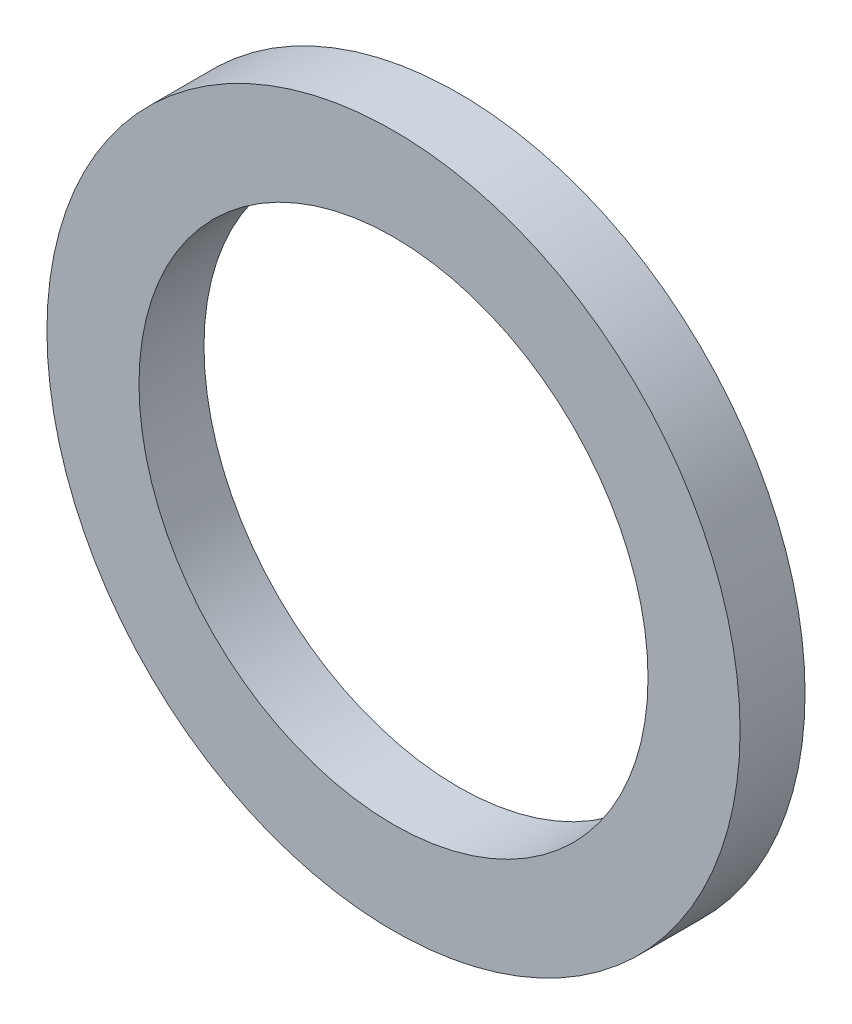
ISO-10303-21;
HEADER;
FILE_DESCRIPTION(('STEP AP214'),'2;1');
FILE_NAME('part.step','',(''),(''),'','','');
FILE_SCHEMA(('AUTOMOTIVE_DESIGN { 1 0 10303 214 1 1 1 1 }'));
ENDSEC;
DATA;
#1=APPLICATION_CONTEXT('core data for automotive mechanical design processes');
#2=APPLICATION_PROTOCOL_DEFINITION('international standard','automotive_design',2000,#1);
#3=PRODUCT_CONTEXT('',#1,'mechanical');
#4=PRODUCT('Part','Part','',(#3));
#5=PRODUCT_RELATED_PRODUCT_CATEGORY('part','',(#4));
#6=PRODUCT_DEFINITION_FORMATION('','',#4);
#7=PRODUCT_DEFINITION_CONTEXT('part definition',#1,'design');
#8=PRODUCT_DEFINITION('design','',#6,#7);
#9=PRODUCT_DEFINITION_SHAPE('','',#8);
#10=(LENGTH_UNIT() NAMED_UNIT(*) SI_UNIT(.MILLI.,.METRE.));
#11=(NAMED_UNIT(*) PLANE_ANGLE_UNIT() SI_UNIT($,.RADIAN.));
#12=(NAMED_UNIT(*) SI_UNIT($,.STERADIAN.) SOLID_ANGLE_UNIT());
#13=UNCERTAINTY_MEASURE_WITH_UNIT(LENGTH_MEASURE(1.E-05),#10,'distance_accuracy_value','');
#14=(GEOMETRIC_REPRESENTATION_CONTEXT(3) GLOBAL_UNCERTAINTY_ASSIGNED_CONTEXT((#13)) GLOBAL_UNIT_ASSIGNED_CONTEXT((#10,
#11,#12)) REPRESENTATION_CONTEXT('',''));
#15=CARTESIAN_POINT('',(0.,0.,0.));
#16=DIRECTION('',(0.,0.,1.));
#17=DIRECTION('',(1.,0.,0.));
#18=AXIS2_PLACEMENT_3D('',#15,#16,#17);
#19=CARTESIAN_POINT('',(0.,0.,0.6));
#20=DIRECTION('',(0.,0.,1.));
#21=DIRECTION('',(1.,0.,0.));
#22=AXIS2_PLACEMENT_3D('',#19,#20,#21);
#23=PLANE('',#22);
#24=CARTESIAN_POINT('',(0.,0.,0.6));
#25=DIRECTION('',(0.,0.,1.));
#26=DIRECTION('',(1.,0.,0.));
#27=AXIS2_PLACEMENT_3D('',#24,#25,#26);
#28=CIRCLE('',#27,3.2);
#29=CARTESIAN_POINT('',(3.2,0.,0.6));
#30=VERTEX_POINT('',#29);
#31=EDGE_CURVE('E10',#30,#30,#28,.T.);
#32=ORIENTED_EDGE('',*,*,#31,.T.);
#33=EDGE_LOOP('',(#32));
#34=FACE_BOUND('',#33,.T.);
#35=CARTESIAN_POINT('',(0.,0.,0.6));
#36=DIRECTION('',(0.,0.,1.));
#37=DIRECTION('',(1.,0.,0.));
#38=AXIS2_PLACEMENT_3D('',#35,#36,#37);
#39=CIRCLE('',#38,2.35);
#40=CARTESIAN_POINT('',(2.35,0.,0.6));
#41=VERTEX_POINT('',#40);
#42=EDGE_CURVE('E50',#41,#41,#39,.T.);
#43=ORIENTED_EDGE('',*,*,#42,.F.);
#44=EDGE_LOOP('',(#43));
#45=FACE_BOUND('',#44,.T.);
#46=ADVANCED_FACE('F39',(#34,#45),#23,.T.);
#47=CARTESIAN_POINT('',(0.,0.,0.));
#48=DIRECTION('',(0.,0.,1.));
#49=DIRECTION('',(1.,0.,0.));
#50=AXIS2_PLACEMENT_3D('',#47,#48,#49);
#51=PLANE('',#50);
#52=CARTESIAN_POINT('',(0.,0.,0.));
#53=DIRECTION('',(0.,0.,1.));
#54=DIRECTION('',(1.,0.,0.));
#55=AXIS2_PLACEMENT_3D('',#52,#53,#54);
#56=CIRCLE('',#55,3.2);
#57=CARTESIAN_POINT('',(3.2,0.,0.));
#58=VERTEX_POINT('',#57);
#59=EDGE_CURVE('E43',#58,#58,#56,.T.);
#60=ORIENTED_EDGE('',*,*,#59,.F.);
#61=EDGE_LOOP('',(#60));
#62=FACE_BOUND('',#61,.T.);
#63=CARTESIAN_POINT('',(0.,0.,0.));
#64=DIRECTION('',(0.,0.,1.));
#65=DIRECTION('',(1.,0.,0.));
#66=AXIS2_PLACEMENT_3D('',#63,#64,#65);
#67=CIRCLE('',#66,2.35);
#68=CARTESIAN_POINT('',(2.35,0.,0.));
#69=VERTEX_POINT('',#68);
#70=EDGE_CURVE('E52',#69,#69,#67,.T.);
#71=ORIENTED_EDGE('',*,*,#70,.T.);
#72=EDGE_LOOP('',(#71));
#73=FACE_BOUND('',#72,.T.);
#74=ADVANCED_FACE('F62',(#62,#73),#51,.F.);
#75=CARTESIAN_POINT('',(0.,0.,0.6));
#76=DIRECTION('',(0.,0.,-1.));
#77=DIRECTION('',(-1.,0.,0.));
#78=AXIS2_PLACEMENT_3D('',#75,#76,#77);
#79=CYLINDRICAL_SURFACE('',#78,3.2);
#80=ORIENTED_EDGE('',*,*,#31,.F.);
#81=EDGE_LOOP('',(#80));
#82=FACE_BOUND('',#81,.T.);
#83=ORIENTED_EDGE('',*,*,#59,.T.);
#84=EDGE_LOOP('',(#83));
#85=FACE_BOUND('',#84,.T.);
#86=ADVANCED_FACE('F41',(#82,#85),#79,.T.);
#87=CARTESIAN_POINT('',(0.,0.,0.6));
#88=DIRECTION('',(0.,0.,-1.));
#89=DIRECTION('',(-1.,0.,0.));
#90=AXIS2_PLACEMENT_3D('',#87,#88,#89);
#91=CYLINDRICAL_SURFACE('',#90,2.35);
#92=ORIENTED_EDGE('',*,*,#42,.T.);
#93=EDGE_LOOP('',(#92));
#94=FACE_BOUND('',#93,.T.);
#95=ORIENTED_EDGE('',*,*,#70,.F.);
#96=EDGE_LOOP('',(#95));
#97=FACE_BOUND('',#96,.T.);
#98=ADVANCED_FACE('F58',(#94,#97),#91,.F.);
#99=CLOSED_SHELL('',(#46,#74,#86,#98));
#100=MANIFOLD_SOLID_BREP('B2',#99);
#101=ADVANCED_BREP_SHAPE_REPRESENTATION('',(#18,#100),#14);
#102=SHAPE_DEFINITION_REPRESENTATION(#9,#101);
ENDSEC;
END-ISO-10303-21;
